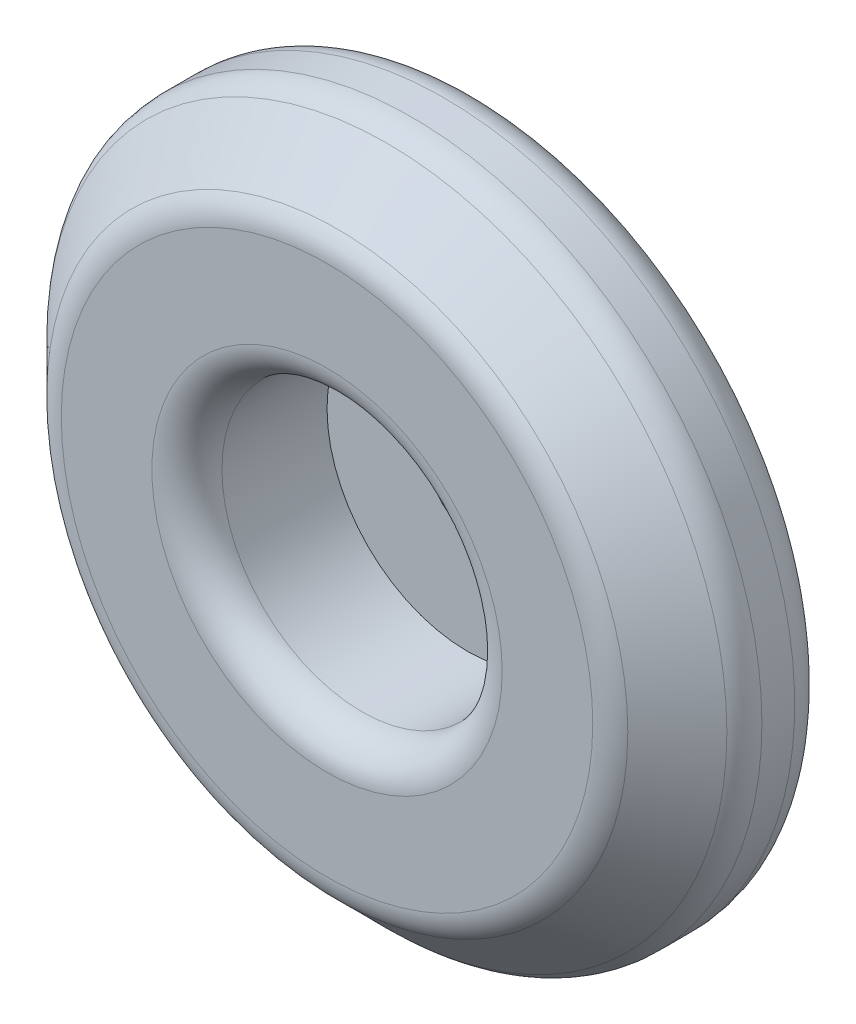
ISO-10303-21;
HEADER;
FILE_DESCRIPTION(('STEP AP214'),'2;1');
FILE_NAME('part.step','',(''),(''),'','','');
FILE_SCHEMA(('AUTOMOTIVE_DESIGN { 1 0 10303 214 1 1 1 1 }'));
ENDSEC;
DATA;
#1=APPLICATION_CONTEXT('core data for automotive mechanical design processes');
#2=APPLICATION_PROTOCOL_DEFINITION('international standard','automotive_design',2000,#1);
#3=PRODUCT_CONTEXT('',#1,'mechanical');
#4=PRODUCT('Part','Part','',(#3));
#5=PRODUCT_RELATED_PRODUCT_CATEGORY('part','',(#4));
#6=PRODUCT_DEFINITION_FORMATION('','',#4);
#7=PRODUCT_DEFINITION_CONTEXT('part definition',#1,'design');
#8=PRODUCT_DEFINITION('design','',#6,#7);
#9=PRODUCT_DEFINITION_SHAPE('','',#8);
#10=(LENGTH_UNIT() NAMED_UNIT(*) SI_UNIT(.MILLI.,.METRE.));
#11=(NAMED_UNIT(*) PLANE_ANGLE_UNIT() SI_UNIT($,.RADIAN.));
#12=(NAMED_UNIT(*) SI_UNIT($,.STERADIAN.) SOLID_ANGLE_UNIT());
#13=UNCERTAINTY_MEASURE_WITH_UNIT(LENGTH_MEASURE(1.E-05),#10,'distance_accuracy_value','');
#14=(GEOMETRIC_REPRESENTATION_CONTEXT(3) GLOBAL_UNCERTAINTY_ASSIGNED_CONTEXT((#13)) GLOBAL_UNIT_ASSIGNED_CONTEXT((#10,
#11,#12)) REPRESENTATION_CONTEXT('',''));
#15=CARTESIAN_POINT('',(0.,0.,0.));
#16=DIRECTION('',(0.,0.,1.));
#17=DIRECTION('',(1.,0.,0.));
#18=AXIS2_PLACEMENT_3D('',#15,#16,#17);
#19=CARTESIAN_POINT('',(0.,0.,25.4000000000001));
#20=DIRECTION('',(0.,0.,1.));
#21=DIRECTION('',(1.,0.,0.));
#22=AXIS2_PLACEMENT_3D('',#19,#20,#21);
#23=CONICAL_SURFACE('',#22,63.5,1.15257199721567);
#24=CARTESIAN_POINT('',(0.,0.,23.7239907819731));
#25=DIRECTION('',(0.,0.,1.));
#26=DIRECTION('',(1.,0.,0.));
#27=AXIS2_PLACEMENT_3D('',#24,#25,#26);
#28=CIRCLE('',#27,59.7289792594394);
#29=CARTESIAN_POINT('',(59.7289792594392,0.,23.7239907819731));
#30=VERTEX_POINT('',#29);
#31=EDGE_CURVE('E12',#30,#30,#28,.F.);
#32=CARTESIAN_POINT('',(0.,0.,2.82222222222228));
#33=DIRECTION('',(0.,0.,1.));
#34=DIRECTION('',(1.,0.,0.));
#35=AXIS2_PLACEMENT_3D('',#32,#33,#34);
#36=CIRCLE('',#35,12.7);
#37=CARTESIAN_POINT('',(12.6999999999999,0.,2.82222222222228));
#38=VERTEX_POINT('',#37);
#39=EDGE_CURVE('E81',#38,#38,#36,.T.);
#40=CARTESIAN_POINT('',(59.7289792594392,0.,23.7239907819731));
#41=CARTESIAN_POINT('',(59.23909405882,0.,23.5062640261423));
#42=CARTESIAN_POINT('',(58.7492088582009,0.,23.2885372703116));
#43=CARTESIAN_POINT('',(57.7694384569626,0.,22.8530837586501));
#44=CARTESIAN_POINT('',(57.2795532563434,0.,22.6353570028194));
#45=CARTESIAN_POINT('',(56.2997828551051,0.,22.1999034911579));
#46=CARTESIAN_POINT('',(55.8098976544859,0.,21.9821767353272));
#47=CARTESIAN_POINT('',(54.8301272532476,0.,21.5467232236657));
#48=CARTESIAN_POINT('',(54.3402420526285,0.,21.328996467835));
#49=CARTESIAN_POINT('',(53.3604716513901,0.,20.8935429561735));
#50=CARTESIAN_POINT('',(52.870586450771,0.,20.6758162003427));
#51=CARTESIAN_POINT('',(51.8908160495327,0.,20.2403626886813));
#52=CARTESIAN_POINT('',(51.4009308489135,0.,20.0226359328505));
#53=CARTESIAN_POINT('',(50.4211604476752,0.,19.5871824211891));
#54=CARTESIAN_POINT('',(49.931275247056,0.,19.3694556653583));
#55=CARTESIAN_POINT('',(48.9515048458177,0.,18.9340021536968));
#56=CARTESIAN_POINT('',(48.4616196451985,0.,18.7162753978661));
#57=CARTESIAN_POINT('',(47.4818492439602,0.,18.2808218862046));
#58=CARTESIAN_POINT('',(46.9919640433411,0.,18.0630951303739));
#59=CARTESIAN_POINT('',(46.0121936421027,0.,17.6276416187124));
#60=CARTESIAN_POINT('',(45.5223084414836,0.,17.4099148628817));
#61=CARTESIAN_POINT('',(44.5425380402453,0.,16.9744613512202));
#62=CARTESIAN_POINT('',(44.0526528396261,0.,16.7567345953895));
#63=CARTESIAN_POINT('',(43.0728824383878,0.,16.321281083728));
#64=CARTESIAN_POINT('',(42.5829972377686,0.,16.1035543278973));
#65=CARTESIAN_POINT('',(41.6032268365303,0.,15.6681008162358));
#66=CARTESIAN_POINT('',(41.1133416359112,0.,15.450374060405));
#67=CARTESIAN_POINT('',(40.1335712346728,0.,15.0149205487436));
#68=CARTESIAN_POINT('',(39.6436860340537,0.,14.7971937929128));
#69=CARTESIAN_POINT('',(38.6639156328154,0.,14.3617402812514));
#70=CARTESIAN_POINT('',(38.1740304321962,0.,14.1440135254206));
#71=CARTESIAN_POINT('',(37.1942600309579,0.,13.7085600137591));
#72=CARTESIAN_POINT('',(36.7043748303387,0.,13.4908332579284));
#73=CARTESIAN_POINT('',(35.7246044291004,0.,13.0553797462669));
#74=CARTESIAN_POINT('',(35.2347192284812,0.,12.8376529904362));
#75=CARTESIAN_POINT('',(34.2549488272429,0.,12.4021994787747));
#76=CARTESIAN_POINT('',(33.7650636266238,0.,12.184472722944));
#77=CARTESIAN_POINT('',(32.7852932253854,0.,11.7490192112825));
#78=CARTESIAN_POINT('',(32.2954080247663,0.,11.5312924554518));
#79=CARTESIAN_POINT('',(31.315637623528,0.,11.0958389437903));
#80=CARTESIAN_POINT('',(30.8257524229088,0.,10.8781121879596));
#81=CARTESIAN_POINT('',(29.8459820216705,0.,10.4426586762981));
#82=CARTESIAN_POINT('',(29.3560968210513,0.,10.2249319204674));
#83=CARTESIAN_POINT('',(28.376326419813,0.,9.78947840880588));
#84=CARTESIAN_POINT('',(27.8864412191939,0.,9.57175165297514));
#85=CARTESIAN_POINT('',(26.9066708179555,0.,9.13629814131366));
#86=CARTESIAN_POINT('',(26.4167856173364,0.,8.91857138548293));
#87=CARTESIAN_POINT('',(25.4370152160981,0.,8.48311787382145));
#88=CARTESIAN_POINT('',(24.9471300154789,0.,8.26539111799072));
#89=CARTESIAN_POINT('',(23.9673596142406,0.,7.82993760632924));
#90=CARTESIAN_POINT('',(23.4774744136214,0.,7.6122108504985));
#91=CARTESIAN_POINT('',(22.4977040123831,0.,7.17675733883703));
#92=CARTESIAN_POINT('',(22.007818811764,0.,6.95903058300629));
#93=CARTESIAN_POINT('',(21.0280484105256,0.,6.52357707134482));
#94=CARTESIAN_POINT('',(20.5381632099065,0.,6.30585031551408));
#95=CARTESIAN_POINT('',(19.5583928086681,0.,5.87039680385261));
#96=CARTESIAN_POINT('',(19.068507608049,0.,5.65267004802187));
#97=CARTESIAN_POINT('',(18.0887372068107,0.,5.21721653636039));
#98=CARTESIAN_POINT('',(17.5988520061915,0.,4.99948978052966));
#99=CARTESIAN_POINT('',(16.6190816049532,0.,4.56403626886818));
#100=CARTESIAN_POINT('',(16.129196404334,0.,4.34630951303744));
#101=CARTESIAN_POINT('',(15.1494260030957,0.,3.91085600137597));
#102=CARTESIAN_POINT('',(14.6595408024766,0.,3.69312924554523));
#103=CARTESIAN_POINT('',(13.6797704012382,0.,3.25767573388376));
#104=CARTESIAN_POINT('',(13.1898852006191,0.,3.03994897805302));
#105=CARTESIAN_POINT('',(12.6999999999999,0.,2.82222222222228));
#106=B_SPLINE_CURVE_WITH_KNOTS('',3,(#40,#41,#42,#43,#44,#45,#46,#47,#48,#49,#50,#51,#52,#53,
#54,#55,#56,#57,#58,#59,#60,#61,#62,#63,#64,#65,#66,#67,#68,#69,#70,#71,#72,#73,#74,#75,#76,#77,
#78,#79,#80,#81,#82,#83,#84,#85,#86,#87,#88,#89,#90,#91,#92,#93,#94,#95,#96,#97,#98,#99,#100,
#101,#102,#103,#104,#105),.UNSPECIFIED.,.F.,.F.,(4,2,2,2,2,2,2,2,2,2,2,2,2,2,2,2,2,2,2,2,2,2,2,
2,2,2,2,2,2,2,2,2,4),(0.,1.60826989336748,3.21653978673497,4.82480968010245,6.43307957346994,
8.04134946683742,9.64961936020491,11.2578892535724,12.8661591469399,14.4744290403074,
16.0826989336749,17.6909688270423,19.2992387204098,20.9075086137773,22.5157785071448,
24.1240484005123,25.7323182938798,27.3405881872472,28.9488580806147,30.5571279739822,
32.1653978673497,33.7736677607172,35.3819376540847,36.9902075474522,38.5984774408196,
40.2067473341871,41.8150172275546,43.4232871209221,45.0315570142896,46.639826907657,
48.2480968010245,49.856366694392,51.4646365877595),.UNSPECIFIED.);
#107=EDGE_CURVE('BSEAM44',#30,#38,#106,.T.);
#108=ORIENTED_EDGE('',*,*,#31,.T.);
#109=ORIENTED_EDGE('',*,*,#39,.T.);
#110=ORIENTED_EDGE('',*,*,#107,.T.);
#111=ORIENTED_EDGE('',*,*,#107,.F.);
#112=EDGE_LOOP('',(#108,#110,#109,#111));
#113=FACE_BOUND('',#112,.T.);
#114=ADVANCED_FACE('F44',(#113),#23,.T.);
#115=CARTESIAN_POINT('',(0.,0.,50.8));
#116=DIRECTION('',(0.,0.,-1.));
#117=DIRECTION('',(-1.,0.,0.));
#118=AXIS2_PLACEMENT_3D('',#115,#116,#117);
#119=CYLINDRICAL_SURFACE('',#118,63.5);
#120=CARTESIAN_POINT('',(0.,0.,35.4697438789309));
#121=DIRECTION('',(0.,0.,1.));
#122=DIRECTION('',(1.,0.,0.));
#123=AXIS2_PLACEMENT_3D('',#120,#121,#122);
#124=CIRCLE('',#123,63.5);
#125=CARTESIAN_POINT('',(63.5,0.,35.4697438789309));
#126=VERTEX_POINT('',#125);
#127=EDGE_CURVE('E51',#126,#126,#124,.F.);
#128=ORIENTED_EDGE('',*,*,#127,.T.);
#129=EDGE_LOOP('',(#128));
#130=FACE_BOUND('',#129,.T.);
#131=CARTESIAN_POINT('',(0.,0.,29.5266941157117));
#132=DIRECTION('',(0.,0.,-1.));
#133=DIRECTION('',(-1.,0.,0.));
#134=AXIS2_PLACEMENT_3D('',#131,#132,#133);
#135=CIRCLE('',#134,63.5);
#136=CARTESIAN_POINT('',(-63.5,0.,29.5266941157117));
#137=VERTEX_POINT('',#136);
#138=EDGE_CURVE('E55',#137,#137,#135,.F.);
#139=ORIENTED_EDGE('',*,*,#138,.T.);
#140=EDGE_LOOP('',(#139));
#141=FACE_BOUND('',#140,.T.);
#142=ADVANCED_FACE('F120',(#130,#141),#119,.T.);
#143=CARTESIAN_POINT('',(0.,0.,50.8));
#144=DIRECTION('',(0.,0.,1.));
#145=DIRECTION('',(1.,0.,0.));
#146=AXIS2_PLACEMENT_3D('',#143,#144,#145);
#147=PLANE('',#146);
#148=CARTESIAN_POINT('',(0.,0.,50.8));
#149=DIRECTION('',(0.,0.,1.));
#150=DIRECTION('',(1.,0.,0.));
#151=AXIS2_PLACEMENT_3D('',#148,#149,#150);
#152=CIRCLE('',#151,31.75);
#153=CARTESIAN_POINT('',(31.75,0.,50.8));
#154=VERTEX_POINT('',#153);
#155=EDGE_CURVE('E67',#154,#154,#152,.F.);
#156=ORIENTED_EDGE('',*,*,#155,.T.);
#157=EDGE_LOOP('',(#156));
#158=FACE_BOUND('',#157,.T.);
#159=CARTESIAN_POINT('',(0.,0.,50.8));
#160=DIRECTION('',(0.,0.,1.));
#161=DIRECTION('',(1.,0.,0.));
#162=AXIS2_PLACEMENT_3D('',#159,#160,#161);
#163=CIRCLE('',#162,48.1697438789309);
#164=CARTESIAN_POINT('',(48.1697438789309,0.,50.8));
#165=VERTEX_POINT('',#164);
#166=EDGE_CURVE('E70',#165,#165,#163,.T.);
#167=ORIENTED_EDGE('',*,*,#166,.T.);
#168=EDGE_LOOP('',(#167));
#169=FACE_BOUND('',#168,.T.);
#170=ADVANCED_FACE('F114',(#158,#169),#147,.T.);
#171=CARTESIAN_POINT('',(0.,0.,25.4000000000001));
#172=DIRECTION('',(0.,0.,1.));
#173=DIRECTION('',(1.,0.,0.));
#174=AXIS2_PLACEMENT_3D('',#171,#172,#173);
#175=CYLINDRICAL_SURFACE('',#174,25.4);
#176=CARTESIAN_POINT('',(0.,0.,44.4500000000001));
#177=DIRECTION('',(0.,0.,1.));
#178=DIRECTION('',(1.,0.,0.));
#179=AXIS2_PLACEMENT_3D('',#176,#177,#178);
#180=CIRCLE('',#179,25.4);
#181=CARTESIAN_POINT('',(25.4,0.,44.4500000000001));
#182=VERTEX_POINT('',#181);
#183=EDGE_CURVE('E73',#182,#182,#180,.T.);
#184=ORIENTED_EDGE('',*,*,#183,.T.);
#185=EDGE_LOOP('',(#184));
#186=FACE_BOUND('',#185,.T.);
#187=CARTESIAN_POINT('',(0.,0.,25.4000000000001));
#188=DIRECTION('',(0.,0.,1.));
#189=DIRECTION('',(1.,0.,0.));
#190=AXIS2_PLACEMENT_3D('',#187,#188,#189);
#191=CIRCLE('',#190,25.4);
#192=CARTESIAN_POINT('',(25.4,0.,25.4000000000001));
#193=VERTEX_POINT('',#192);
#194=EDGE_CURVE('E76',#193,#193,#191,.T.);
#195=ORIENTED_EDGE('',*,*,#194,.F.);
#196=EDGE_LOOP('',(#195));
#197=FACE_BOUND('',#196,.T.);
#198=ADVANCED_FACE('F109',(#186,#197),#175,.F.);
#199=CARTESIAN_POINT('',(0.,0.,25.4000000000001));
#200=DIRECTION('',(0.,0.,1.));
#201=DIRECTION('',(1.,0.,0.));
#202=AXIS2_PLACEMENT_3D('',#199,#200,#201);
#203=PLANE('',#202);
#204=CARTESIAN_POINT('',(0.,0.,25.4000000000001));
#205=DIRECTION('',(0.,0.,1.));
#206=DIRECTION('',(1.,0.,0.));
#207=AXIS2_PLACEMENT_3D('',#204,#205,#206);
#208=CIRCLE('',#207,6.35);
#209=CARTESIAN_POINT('',(6.35,0.,25.4000000000001));
#210=VERTEX_POINT('',#209);
#211=EDGE_CURVE('E80',#210,#210,#208,.T.);
#212=ORIENTED_EDGE('',*,*,#211,.F.);
#213=EDGE_LOOP('',(#212));
#214=FACE_BOUND('',#213,.T.);
#215=ORIENTED_EDGE('',*,*,#194,.T.);
#216=EDGE_LOOP('',(#215));
#217=FACE_BOUND('',#216,.T.);
#218=ADVANCED_FACE('F103',(#214,#217),#203,.T.);
#219=CARTESIAN_POINT('',(0.,0.,0.));
#220=DIRECTION('',(0.,0.,1.));
#221=DIRECTION('',(1.,0.,0.));
#222=AXIS2_PLACEMENT_3D('',#219,#220,#221);
#223=CYLINDRICAL_SURFACE('',#222,6.35);
#224=CARTESIAN_POINT('',(0.,0.,6.35000000000008));
#225=DIRECTION('',(0.,0.,1.));
#226=DIRECTION('',(1.,0.,0.));
#227=AXIS2_PLACEMENT_3D('',#224,#225,#226);
#228=CIRCLE('',#227,6.35);
#229=CARTESIAN_POINT('',(6.35,0.,6.35000000000008));
#230=VERTEX_POINT('',#229);
#231=EDGE_CURVE('E77',#230,#230,#228,.F.);
#232=ORIENTED_EDGE('',*,*,#231,.T.);
#233=EDGE_LOOP('',(#232));
#234=FACE_BOUND('',#233,.T.);
#235=ORIENTED_EDGE('',*,*,#211,.T.);
#236=EDGE_LOOP('',(#235));
#237=FACE_BOUND('',#236,.T.);
#238=ADVANCED_FACE('F97',(#234,#237),#223,.F.);
#239=CARTESIAN_POINT('',(0.,0.,6.35000000000008));
#240=DIRECTION('',(0.,0.,1.));
#241=DIRECTION('',(1.,0.,0.));
#242=AXIS2_PLACEMENT_3D('',#239,#240,#241);
#243=PLANE('',#242);
#244=CARTESIAN_POINT('',(0.,0.,6.35000000000008));
#245=DIRECTION('',(0.,0.,1.));
#246=DIRECTION('',(1.,0.,0.));
#247=AXIS2_PLACEMENT_3D('',#244,#245,#246);
#248=CIRCLE('',#247,12.7);
#249=CARTESIAN_POINT('',(12.7,0.,6.35000000000008));
#250=VERTEX_POINT('',#249);
#251=EDGE_CURVE('E84',#250,#250,#248,.T.);
#252=ORIENTED_EDGE('',*,*,#251,.F.);
#253=EDGE_LOOP('',(#252));
#254=FACE_BOUND('',#253,.T.);
#255=ORIENTED_EDGE('',*,*,#231,.F.);
#256=EDGE_LOOP('',(#255));
#257=FACE_BOUND('',#256,.T.);
#258=ADVANCED_FACE('F94',(#254,#257),#243,.F.);
#259=CARTESIAN_POINT('',(0.,0.,6.35000000000008));
#260=DIRECTION('',(0.,0.,-1.));
#261=DIRECTION('',(-1.,0.,0.));
#262=AXIS2_PLACEMENT_3D('',#259,#260,#261);
#263=CYLINDRICAL_SURFACE('',#262,12.7);
#264=ORIENTED_EDGE('',*,*,#39,.F.);
#265=EDGE_LOOP('',(#264));
#266=FACE_BOUND('',#265,.T.);
#267=ORIENTED_EDGE('',*,*,#251,.T.);
#268=EDGE_LOOP('',(#267));
#269=FACE_BOUND('',#268,.T.);
#270=ADVANCED_FACE('F92',(#266,#269),#263,.F.);
#271=CARTESIAN_POINT('',(0.,0.,50.8));
#272=DIRECTION('',(0.,0.,-1.));
#273=DIRECTION('',(-1.,0.,0.));
#274=AXIS2_PLACEMENT_3D('',#271,#272,#273);
#275=CONICAL_SURFACE('',#274,50.8,0.785398163397447);
#276=CARTESIAN_POINT('',(0.,0.,48.9401280605346));
#277=DIRECTION('',(0.,0.,1.));
#278=DIRECTION('',(1.,0.,0.));
#279=AXIS2_PLACEMENT_3D('',#276,#277,#278);
#280=CIRCLE('',#279,52.6598719394655);
#281=CARTESIAN_POINT('',(52.6598719394655,0.,48.9401280605346));
#282=VERTEX_POINT('',#281);
#283=EDGE_CURVE('E59',#282,#282,#280,.F.);
#284=ORIENTED_EDGE('',*,*,#283,.T.);
#285=EDGE_LOOP('',(#284));
#286=FACE_BOUND('',#285,.T.);
#287=CARTESIAN_POINT('',(0.,0.,39.9598719394654));
#288=DIRECTION('',(0.,0.,-1.));
#289=DIRECTION('',(-1.,0.,0.));
#290=AXIS2_PLACEMENT_3D('',#287,#288,#289);
#291=CIRCLE('',#290,61.6401280605346);
#292=CARTESIAN_POINT('',(-61.6401280605346,0.,39.9598719394654));
#293=VERTEX_POINT('',#292);
#294=EDGE_CURVE('E64',#293,#293,#291,.F.);
#295=ORIENTED_EDGE('',*,*,#294,.T.);
#296=EDGE_LOOP('',(#295));
#297=FACE_BOUND('',#296,.T.);
#298=ADVANCED_FACE('F132',(#286,#297),#275,.T.);
#299=CARTESIAN_POINT('',(0.,0.,44.4500000000001));
#300=DIRECTION('',(0.,0.,1.));
#301=DIRECTION('',(1.,0.,0.));
#302=AXIS2_PLACEMENT_3D('',#299,#300,#301);
#303=TOROIDAL_SURFACE('',#302,31.75,6.35);
#304=ORIENTED_EDGE('',*,*,#155,.F.);
#305=EDGE_LOOP('',(#304));
#306=FACE_BOUND('',#305,.T.);
#307=ORIENTED_EDGE('',*,*,#183,.F.);
#308=EDGE_LOOP('',(#307));
#309=FACE_BOUND('',#308,.T.);
#310=ADVANCED_FACE('F137',(#306,#309),#303,.T.);
#311=CARTESIAN_POINT('',(0.,0.,44.4500000000001));
#312=DIRECTION('',(0.,0.,1.));
#313=DIRECTION('',(1.,0.,0.));
#314=AXIS2_PLACEMENT_3D('',#311,#312,#313);
#315=TOROIDAL_SURFACE('',#314,48.1697438789309,6.35);
#316=ORIENTED_EDGE('',*,*,#283,.F.);
#317=EDGE_LOOP('',(#316));
#318=FACE_BOUND('',#317,.T.);
#319=ORIENTED_EDGE('',*,*,#166,.F.);
#320=EDGE_LOOP('',(#319));
#321=FACE_BOUND('',#320,.T.);
#322=ADVANCED_FACE('F144',(#318,#321),#315,.T.);
#323=CARTESIAN_POINT('',(0.,0.,35.4697438789309));
#324=DIRECTION('',(0.,0.,1.));
#325=DIRECTION('',(1.,0.,0.));
#326=AXIS2_PLACEMENT_3D('',#323,#324,#325);
#327=TOROIDAL_SURFACE('',#326,57.15,6.35);
#328=ORIENTED_EDGE('',*,*,#294,.F.);
#329=EDGE_LOOP('',(#328));
#330=FACE_BOUND('',#329,.T.);
#331=ORIENTED_EDGE('',*,*,#127,.F.);
#332=EDGE_LOOP('',(#331));
#333=FACE_BOUND('',#332,.T.);
#334=ADVANCED_FACE('F150',(#330,#333),#327,.T.);
#335=CARTESIAN_POINT('',(0.,0.,29.5266941157117));
#336=DIRECTION('',(0.,0.,-1.));
#337=DIRECTION('',(-1.,0.,0.));
#338=AXIS2_PLACEMENT_3D('',#335,#336,#337);
#339=TOROIDAL_SURFACE('',#338,57.15,6.35);
#340=ORIENTED_EDGE('',*,*,#31,.F.);
#341=EDGE_LOOP('',(#340));
#342=FACE_BOUND('',#341,.T.);
#343=ORIENTED_EDGE('',*,*,#138,.F.);
#344=EDGE_LOOP('',(#343));
#345=FACE_BOUND('',#344,.T.);
#346=ADVANCED_FACE('F46',(#342,#345),#339,.T.);
#347=CLOSED_SHELL('',(#114,#142,#170,#198,#218,#238,#258,#270,#298,#310,#322,#334,#346));
#348=MANIFOLD_SOLID_BREP('B2',#347);
#349=ADVANCED_BREP_SHAPE_REPRESENTATION('',(#18,#348),#14);
#350=SHAPE_DEFINITION_REPRESENTATION(#9,#349);
ENDSEC;
END-ISO-10303-21;
